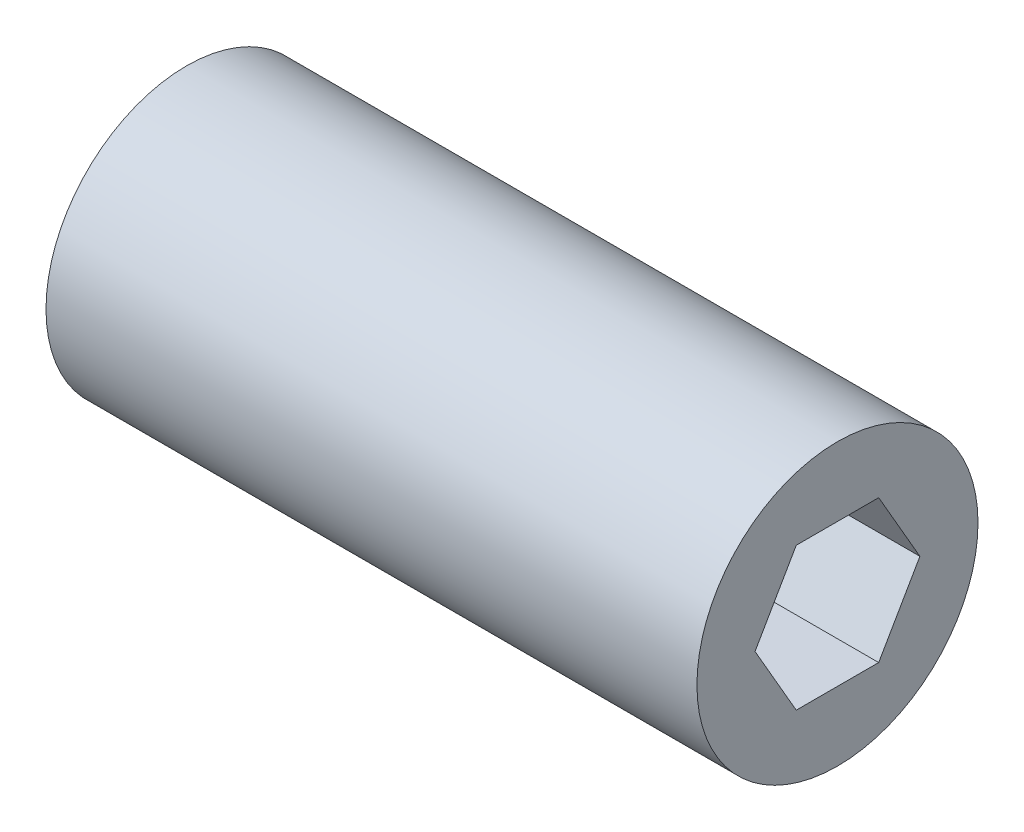
ISO-10303-21;
HEADER;
FILE_DESCRIPTION(('STEP AP214'),'2;1');
FILE_NAME('part.step','',(''),(''),'','','');
FILE_SCHEMA(('AUTOMOTIVE_DESIGN { 1 0 10303 214 1 1 1 1 }'));
ENDSEC;
DATA;
#1=APPLICATION_CONTEXT('core data for automotive mechanical design processes');
#2=APPLICATION_PROTOCOL_DEFINITION('international standard','automotive_design',2000,#1);
#3=PRODUCT_CONTEXT('',#1,'mechanical');
#4=PRODUCT('Part','Part','',(#3));
#5=PRODUCT_RELATED_PRODUCT_CATEGORY('part','',(#4));
#6=PRODUCT_DEFINITION_FORMATION('','',#4);
#7=PRODUCT_DEFINITION_CONTEXT('part definition',#1,'design');
#8=PRODUCT_DEFINITION('design','',#6,#7);
#9=PRODUCT_DEFINITION_SHAPE('','',#8);
#10=(LENGTH_UNIT() NAMED_UNIT(*) SI_UNIT(.MILLI.,.METRE.));
#11=(NAMED_UNIT(*) PLANE_ANGLE_UNIT() SI_UNIT($,.RADIAN.));
#12=(NAMED_UNIT(*) SI_UNIT($,.STERADIAN.) SOLID_ANGLE_UNIT());
#13=UNCERTAINTY_MEASURE_WITH_UNIT(LENGTH_MEASURE(1.E-05),#10,'distance_accuracy_value','');
#14=(GEOMETRIC_REPRESENTATION_CONTEXT(3) GLOBAL_UNCERTAINTY_ASSIGNED_CONTEXT((#13)) GLOBAL_UNIT_ASSIGNED_CONTEXT((#10,
#11,#12)) REPRESENTATION_CONTEXT('',''));
#15=CARTESIAN_POINT('',(0.,0.,0.));
#16=DIRECTION('',(0.,0.,1.));
#17=DIRECTION('',(1.,0.,0.));
#18=AXIS2_PLACEMENT_3D('',#15,#16,#17);
#19=CARTESIAN_POINT('',(57.9,0.,0.));
#20=DIRECTION('',(1.,0.,0.));
#21=DIRECTION('',(0.,0.,-1.));
#22=AXIS2_PLACEMENT_3D('',#19,#20,#21);
#23=PLANE('',#22);
#24=CARTESIAN_POINT('',(57.9,0.,0.));
#25=DIRECTION('',(1.,0.,0.));
#26=DIRECTION('',(0.,0.,-1.));
#27=AXIS2_PLACEMENT_3D('',#24,#25,#26);
#28=CIRCLE('',#27,12.5);
#29=CARTESIAN_POINT('',(57.9,0.,12.5));
#30=VERTEX_POINT('',#29);
#31=EDGE_CURVE('E11',#30,#30,#28,.T.);
#32=ORIENTED_EDGE('',*,*,#31,.T.);
#33=EDGE_LOOP('',(#32));
#34=FACE_BOUND('',#33,.T.);
#35=DIRECTION('',(0.,0.866025403784438,0.500000000000001));
#36=VECTOR('',#35,1.);
#37=CARTESIAN_POINT('',(57.9,0.,-7.33234841870824));
#38=LINE('',#37,#36);
#39=CARTESIAN_POINT('',(57.9,0.,-7.33234841870824));
#40=VERTEX_POINT('',#39);
#41=CARTESIAN_POINT('',(57.9,6.35,-3.6661742093541));
#42=VERTEX_POINT('',#41);
#43=EDGE_CURVE('E102',#40,#42,#38,.T.);
#44=ORIENTED_EDGE('',*,*,#43,.F.);
#45=DIRECTION('',(0.,0.866025403784442,-0.499999999999995));
#46=VECTOR('',#45,1.);
#47=CARTESIAN_POINT('',(57.9,-6.34999999999995,-3.66617420935419));
#48=LINE('',#47,#46);
#49=CARTESIAN_POINT('',(57.9,-6.34999999999995,-3.66617420935419));
#50=VERTEX_POINT('',#49);
#51=EDGE_CURVE('E93',#50,#40,#48,.T.);
#52=ORIENTED_EDGE('',*,*,#51,.F.);
#53=DIRECTION('',(0.,0.,-1.));
#54=VECTOR('',#53,1.);
#55=CARTESIAN_POINT('',(57.9,-6.35000000000003,3.66617420935406));
#56=LINE('',#55,#54);
#57=CARTESIAN_POINT('',(57.9,-6.35000000000003,3.66617420935406));
#58=VERTEX_POINT('',#57);
#59=EDGE_CURVE('E127',#58,#50,#56,.T.);
#60=ORIENTED_EDGE('',*,*,#59,.F.);
#61=DIRECTION('',(0.,-0.866025403784435,-0.500000000000007));
#62=VECTOR('',#61,1.);
#63=CARTESIAN_POINT('',(57.9,0.,7.33234841870824));
#64=LINE('',#63,#62);
#65=CARTESIAN_POINT('',(57.9,0.,7.33234841870824));
#66=VERTEX_POINT('',#65);
#67=EDGE_CURVE('E124',#66,#58,#64,.T.);
#68=ORIENTED_EDGE('',*,*,#67,.F.);
#69=DIRECTION('',(0.,-0.866025403784442,0.499999999999995));
#70=VECTOR('',#69,1.);
#71=CARTESIAN_POINT('',(57.9,6.34999999999998,3.66617420935415));
#72=LINE('',#71,#70);
#73=CARTESIAN_POINT('',(57.9,6.34999999999998,3.66617420935415));
#74=VERTEX_POINT('',#73);
#75=EDGE_CURVE('E119',#74,#66,#72,.T.);
#76=ORIENTED_EDGE('',*,*,#75,.F.);
#77=DIRECTION('',(0.,0.,1.));
#78=VECTOR('',#77,1.);
#79=CARTESIAN_POINT('',(57.9,6.35,-3.6661742093541));
#80=LINE('',#79,#78);
#81=EDGE_CURVE('E115',#42,#74,#80,.T.);
#82=ORIENTED_EDGE('',*,*,#81,.F.);
#83=EDGE_LOOP('',(#44,#52,#60,#68,#76,#82));
#84=FACE_BOUND('',#83,.T.);
#85=ADVANCED_FACE('F39',(#34,#84),#23,.T.);
#86=CARTESIAN_POINT('',(0.,0.,0.));
#87=DIRECTION('',(1.,0.,0.));
#88=DIRECTION('',(0.,0.,-1.));
#89=AXIS2_PLACEMENT_3D('',#86,#87,#88);
#90=PLANE('',#89);
#91=CARTESIAN_POINT('',(0.,0.,0.));
#92=DIRECTION('',(1.,0.,0.));
#93=DIRECTION('',(0.,0.,-1.));
#94=AXIS2_PLACEMENT_3D('',#91,#92,#93);
#95=CIRCLE('',#94,12.5);
#96=CARTESIAN_POINT('',(0.,0.,12.5));
#97=VERTEX_POINT('',#96);
#98=EDGE_CURVE('E43',#97,#97,#95,.T.);
#99=ORIENTED_EDGE('',*,*,#98,.F.);
#100=EDGE_LOOP('',(#99));
#101=FACE_BOUND('',#100,.T.);
#102=DIRECTION('',(0.,0.866025403784442,-0.499999999999995));
#103=VECTOR('',#102,1.);
#104=CARTESIAN_POINT('',(0.,-6.34999999999995,-3.66617420935419));
#105=LINE('',#104,#103);
#106=CARTESIAN_POINT('',(0.,-6.34999999999995,-3.66617420935419));
#107=VERTEX_POINT('',#106);
#108=CARTESIAN_POINT('',(0.,0.,-7.33234841870824));
#109=VERTEX_POINT('',#108);
#110=EDGE_CURVE('E63',#107,#109,#105,.T.);
#111=ORIENTED_EDGE('',*,*,#110,.T.);
#112=DIRECTION('',(0.,0.866025403784438,0.500000000000001));
#113=VECTOR('',#112,1.);
#114=CARTESIAN_POINT('',(0.,0.,-7.33234841870824));
#115=LINE('',#114,#113);
#116=CARTESIAN_POINT('',(0.,6.35,-3.6661742093541));
#117=VERTEX_POINT('',#116);
#118=EDGE_CURVE('E109',#109,#117,#115,.T.);
#119=ORIENTED_EDGE('',*,*,#118,.T.);
#120=DIRECTION('',(0.,0.,1.));
#121=VECTOR('',#120,1.);
#122=CARTESIAN_POINT('',(0.,6.35,-3.6661742093541));
#123=LINE('',#122,#121);
#124=CARTESIAN_POINT('',(0.,6.34999999999998,3.66617420935415));
#125=VERTEX_POINT('',#124);
#126=EDGE_CURVE('E134',#117,#125,#123,.T.);
#127=ORIENTED_EDGE('',*,*,#126,.T.);
#128=DIRECTION('',(0.,-0.866025403784442,0.499999999999995));
#129=VECTOR('',#128,1.);
#130=CARTESIAN_POINT('',(0.,6.34999999999998,3.66617420935415));
#131=LINE('',#130,#129);
#132=CARTESIAN_POINT('',(0.,0.,7.33234841870824));
#133=VERTEX_POINT('',#132);
#134=EDGE_CURVE('E138',#125,#133,#131,.T.);
#135=ORIENTED_EDGE('',*,*,#134,.T.);
#136=DIRECTION('',(0.,-0.866025403784435,-0.500000000000007));
#137=VECTOR('',#136,1.);
#138=CARTESIAN_POINT('',(0.,0.,7.33234841870824));
#139=LINE('',#138,#137);
#140=CARTESIAN_POINT('',(0.,-6.35000000000003,3.66617420935406));
#141=VERTEX_POINT('',#140);
#142=EDGE_CURVE('E142',#133,#141,#139,.T.);
#143=ORIENTED_EDGE('',*,*,#142,.T.);
#144=DIRECTION('',(0.,0.,-1.));
#145=VECTOR('',#144,1.);
#146=CARTESIAN_POINT('',(0.,-6.35000000000003,3.66617420935406));
#147=LINE('',#146,#145);
#148=EDGE_CURVE('E103',#141,#107,#147,.T.);
#149=ORIENTED_EDGE('',*,*,#148,.T.);
#150=EDGE_LOOP('',(#111,#119,#127,#135,#143,#149));
#151=FACE_BOUND('',#150,.T.);
#152=ADVANCED_FACE('F166',(#101,#151),#90,.F.);
#153=CARTESIAN_POINT('',(57.9,0.,0.));
#154=DIRECTION('',(-1.,0.,0.));
#155=DIRECTION('',(0.,0.,1.));
#156=AXIS2_PLACEMENT_3D('',#153,#154,#155);
#157=CYLINDRICAL_SURFACE('',#156,12.5);
#158=CARTESIAN_POINT('',(57.9,0.,12.5));
#159=CARTESIAN_POINT('',(57.296875,0.,12.5));
#160=CARTESIAN_POINT('',(56.69375,0.,12.5));
#161=CARTESIAN_POINT('',(55.4875,0.,12.5));
#162=CARTESIAN_POINT('',(54.884375,0.,12.5));
#163=CARTESIAN_POINT('',(53.678125,0.,12.5));
#164=CARTESIAN_POINT('',(53.075,0.,12.5));
#165=CARTESIAN_POINT('',(51.86875,0.,12.5));
#166=CARTESIAN_POINT('',(51.265625,0.,12.5));
#167=CARTESIAN_POINT('',(50.059375,0.,12.5));
#168=CARTESIAN_POINT('',(49.45625,0.,12.5));
#169=CARTESIAN_POINT('',(48.25,0.,12.5));
#170=CARTESIAN_POINT('',(47.646875,0.,12.5));
#171=CARTESIAN_POINT('',(46.440625,0.,12.5));
#172=CARTESIAN_POINT('',(45.8375,0.,12.5));
#173=CARTESIAN_POINT('',(44.63125,0.,12.5));
#174=CARTESIAN_POINT('',(44.028125,0.,12.5));
#175=CARTESIAN_POINT('',(42.821875,0.,12.5));
#176=CARTESIAN_POINT('',(42.21875,0.,12.5));
#177=CARTESIAN_POINT('',(41.0125,0.,12.5));
#178=CARTESIAN_POINT('',(40.409375,0.,12.5));
#179=CARTESIAN_POINT('',(39.203125,0.,12.5));
#180=CARTESIAN_POINT('',(38.6,0.,12.5));
#181=CARTESIAN_POINT('',(37.39375,0.,12.5));
#182=CARTESIAN_POINT('',(36.790625,0.,12.5));
#183=CARTESIAN_POINT('',(35.584375,0.,12.5));
#184=CARTESIAN_POINT('',(34.98125,0.,12.5));
#185=CARTESIAN_POINT('',(33.775,0.,12.5));
#186=CARTESIAN_POINT('',(33.171875,0.,12.5));
#187=CARTESIAN_POINT('',(31.965625,0.,12.5));
#188=CARTESIAN_POINT('',(31.3625,0.,12.5));
#189=CARTESIAN_POINT('',(30.15625,0.,12.5));
#190=CARTESIAN_POINT('',(29.553125,0.,12.5));
#191=CARTESIAN_POINT('',(28.346875,0.,12.5));
#192=CARTESIAN_POINT('',(27.74375,0.,12.5));
#193=CARTESIAN_POINT('',(26.5375,0.,12.5));
#194=CARTESIAN_POINT('',(25.934375,0.,12.5));
#195=CARTESIAN_POINT('',(24.728125,0.,12.5));
#196=CARTESIAN_POINT('',(24.125,0.,12.5));
#197=CARTESIAN_POINT('',(22.91875,0.,12.5));
#198=CARTESIAN_POINT('',(22.315625,0.,12.5));
#199=CARTESIAN_POINT('',(21.109375,0.,12.5));
#200=CARTESIAN_POINT('',(20.50625,0.,12.5));
#201=CARTESIAN_POINT('',(19.3,0.,12.5));
#202=CARTESIAN_POINT('',(18.696875,0.,12.5));
#203=CARTESIAN_POINT('',(17.490625,0.,12.5));
#204=CARTESIAN_POINT('',(16.8875,0.,12.5));
#205=CARTESIAN_POINT('',(15.68125,0.,12.5));
#206=CARTESIAN_POINT('',(15.078125,0.,12.5));
#207=CARTESIAN_POINT('',(13.871875,0.,12.5));
#208=CARTESIAN_POINT('',(13.26875,0.,12.5));
#209=CARTESIAN_POINT('',(12.0625,0.,12.5));
#210=CARTESIAN_POINT('',(11.459375,0.,12.5));
#211=CARTESIAN_POINT('',(10.253125,0.,12.5));
#212=CARTESIAN_POINT('',(9.65,0.,12.5));
#213=CARTESIAN_POINT('',(8.44375,0.,12.5));
#214=CARTESIAN_POINT('',(7.840625,0.,12.5));
#215=CARTESIAN_POINT('',(6.634375,0.,12.5));
#216=CARTESIAN_POINT('',(6.03125,0.,12.5));
#217=CARTESIAN_POINT('',(4.825,0.,12.5));
#218=CARTESIAN_POINT('',(4.221875,0.,12.5));
#219=CARTESIAN_POINT('',(3.015625,0.,12.5));
#220=CARTESIAN_POINT('',(2.4125,0.,12.5));
#221=CARTESIAN_POINT('',(1.20625,0.,12.5));
#222=CARTESIAN_POINT('',(0.603125,0.,12.5));
#223=CARTESIAN_POINT('',(0.,0.,12.5));
#224=B_SPLINE_CURVE_WITH_KNOTS('',3,(#158,#159,#160,#161,#162,#163,#164,#165,#166,#167,#168,
#169,#170,#171,#172,#173,#174,#175,#176,#177,#178,#179,#180,#181,#182,#183,#184,#185,#186,#187,
#188,#189,#190,#191,#192,#193,#194,#195,#196,#197,#198,#199,#200,#201,#202,#203,#204,#205,#206,
#207,#208,#209,#210,#211,#212,#213,#214,#215,#216,#217,#218,#219,#220,#221,#222,#223),
.UNSPECIFIED.,.F.,.F.,(4,2,2,2,2,2,2,2,2,2,2,2,2,2,2,2,2,2,2,2,2,2,2,2,2,2,2,2,2,2,2,2,4),(0.,
1.809375,3.61875,5.42812500000001,7.2375,9.046875,10.85625,12.665625,14.475,16.284375,18.09375,
19.903125,21.7125,23.521875,25.33125,27.140625,28.95,30.759375,32.56875,34.378125,36.1875,
37.996875,39.80625,41.615625,43.425,45.234375,47.04375,48.853125,50.6625,52.471875,54.28125,
56.090625,57.9),.UNSPECIFIED.);
#225=EDGE_CURVE('BSEAM41',#30,#97,#224,.T.);
#226=ORIENTED_EDGE('',*,*,#31,.F.);
#227=ORIENTED_EDGE('',*,*,#98,.T.);
#228=ORIENTED_EDGE('',*,*,#225,.T.);
#229=ORIENTED_EDGE('',*,*,#225,.F.);
#230=EDGE_LOOP('',(#226,#228,#227,#229));
#231=FACE_BOUND('',#230,.T.);
#232=ADVANCED_FACE('F41',(#231),#157,.T.);
#233=CARTESIAN_POINT('',(57.9,-6.34999999999995,-3.66617420935419));
#234=DIRECTION('',(0.,0.499999999999995,0.866025403784442));
#235=DIRECTION('',(0.,-0.866025403784442,0.499999999999995));
#236=AXIS2_PLACEMENT_3D('',#233,#234,#235);
#237=PLANE('',#236);
#238=ORIENTED_EDGE('',*,*,#110,.F.);
#239=DIRECTION('',(-1.,0.,0.));
#240=VECTOR('',#239,1.);
#241=CARTESIAN_POINT('',(57.9,-6.34999999999995,-3.66617420935419));
#242=LINE('',#241,#240);
#243=EDGE_CURVE('E97',#50,#107,#242,.T.);
#244=ORIENTED_EDGE('',*,*,#243,.F.);
#245=ORIENTED_EDGE('',*,*,#51,.T.);
#246=DIRECTION('',(-1.,0.,0.));
#247=VECTOR('',#246,1.);
#248=CARTESIAN_POINT('',(57.9,0.,-7.33234841870824));
#249=LINE('',#248,#247);
#250=EDGE_CURVE('E96',#40,#109,#249,.T.);
#251=ORIENTED_EDGE('',*,*,#250,.T.);
#252=EDGE_LOOP('',(#238,#244,#245,#251));
#253=FACE_BOUND('',#252,.T.);
#254=ADVANCED_FACE('F95',(#253),#237,.T.);
#255=CARTESIAN_POINT('',(57.9,0.,-7.33234841870824));
#256=DIRECTION('',(0.,-0.500000000000001,0.866025403784438));
#257=DIRECTION('',(0.,-0.866025403784438,-0.500000000000001));
#258=AXIS2_PLACEMENT_3D('',#255,#256,#257);
#259=PLANE('',#258);
#260=ORIENTED_EDGE('',*,*,#118,.F.);
#261=ORIENTED_EDGE('',*,*,#250,.F.);
#262=ORIENTED_EDGE('',*,*,#43,.T.);
#263=DIRECTION('',(-1.,0.,0.));
#264=VECTOR('',#263,1.);
#265=CARTESIAN_POINT('',(57.9,6.35,-3.6661742093541));
#266=LINE('',#265,#264);
#267=EDGE_CURVE('E111',#42,#117,#266,.T.);
#268=ORIENTED_EDGE('',*,*,#267,.T.);
#269=EDGE_LOOP('',(#260,#261,#262,#268));
#270=FACE_BOUND('',#269,.T.);
#271=ADVANCED_FACE('F106',(#270),#259,.T.);
#272=CARTESIAN_POINT('',(57.9,6.35,-3.6661742093541));
#273=DIRECTION('',(0.,-1.,0.));
#274=DIRECTION('',(0.,0.,-1.));
#275=AXIS2_PLACEMENT_3D('',#272,#273,#274);
#276=PLANE('',#275);
#277=ORIENTED_EDGE('',*,*,#126,.F.);
#278=ORIENTED_EDGE('',*,*,#267,.F.);
#279=ORIENTED_EDGE('',*,*,#81,.T.);
#280=DIRECTION('',(-1.,0.,0.));
#281=VECTOR('',#280,1.);
#282=CARTESIAN_POINT('',(57.9,6.34999999999998,3.66617420935415));
#283=LINE('',#282,#281);
#284=EDGE_CURVE('E156',#74,#125,#283,.T.);
#285=ORIENTED_EDGE('',*,*,#284,.T.);
#286=EDGE_LOOP('',(#277,#278,#279,#285));
#287=FACE_BOUND('',#286,.T.);
#288=ADVANCED_FACE('F162',(#287),#276,.T.);
#289=CARTESIAN_POINT('',(57.9,6.34999999999998,3.66617420935415));
#290=DIRECTION('',(0.,-0.499999999999995,-0.866025403784442));
#291=DIRECTION('',(0.,0.866025403784442,-0.499999999999995));
#292=AXIS2_PLACEMENT_3D('',#289,#290,#291);
#293=PLANE('',#292);
#294=ORIENTED_EDGE('',*,*,#134,.F.);
#295=ORIENTED_EDGE('',*,*,#284,.F.);
#296=ORIENTED_EDGE('',*,*,#75,.T.);
#297=DIRECTION('',(-1.,0.,0.));
#298=VECTOR('',#297,1.);
#299=CARTESIAN_POINT('',(57.9,0.,7.33234841870824));
#300=LINE('',#299,#298);
#301=EDGE_CURVE('E153',#66,#133,#300,.T.);
#302=ORIENTED_EDGE('',*,*,#301,.T.);
#303=EDGE_LOOP('',(#294,#295,#296,#302));
#304=FACE_BOUND('',#303,.T.);
#305=ADVANCED_FACE('F174',(#304),#293,.T.);
#306=CARTESIAN_POINT('',(57.9,0.,7.33234841870824));
#307=DIRECTION('',(0.,0.500000000000007,-0.866025403784434));
#308=DIRECTION('',(0.,0.866025403784435,0.500000000000007));
#309=AXIS2_PLACEMENT_3D('',#306,#307,#308);
#310=PLANE('',#309);
#311=ORIENTED_EDGE('',*,*,#142,.F.);
#312=ORIENTED_EDGE('',*,*,#301,.F.);
#313=ORIENTED_EDGE('',*,*,#67,.T.);
#314=DIRECTION('',(-1.,0.,0.));
#315=VECTOR('',#314,1.);
#316=CARTESIAN_POINT('',(57.9,-6.35000000000003,3.66617420935406));
#317=LINE('',#316,#315);
#318=EDGE_CURVE('E55',#58,#141,#317,.T.);
#319=ORIENTED_EDGE('',*,*,#318,.T.);
#320=EDGE_LOOP('',(#311,#312,#313,#319));
#321=FACE_BOUND('',#320,.T.);
#322=ADVANCED_FACE('F172',(#321),#310,.T.);
#323=CARTESIAN_POINT('',(57.9,-6.35000000000003,3.66617420935406));
#324=DIRECTION('',(0.,1.,0.));
#325=DIRECTION('',(0.,0.,1.));
#326=AXIS2_PLACEMENT_3D('',#323,#324,#325);
#327=PLANE('',#326);
#328=ORIENTED_EDGE('',*,*,#148,.F.);
#329=ORIENTED_EDGE('',*,*,#318,.F.);
#330=ORIENTED_EDGE('',*,*,#59,.T.);
#331=ORIENTED_EDGE('',*,*,#243,.T.);
#332=EDGE_LOOP('',(#328,#329,#330,#331));
#333=FACE_BOUND('',#332,.T.);
#334=ADVANCED_FACE('F168',(#333),#327,.T.);
#335=CLOSED_SHELL('',(#85,#152,#232,#254,#271,#288,#305,#322,#334));
#336=MANIFOLD_SOLID_BREP('B2',#335);
#337=ADVANCED_BREP_SHAPE_REPRESENTATION('',(#18,#336),#14);
#338=SHAPE_DEFINITION_REPRESENTATION(#9,#337);
ENDSEC;
END-ISO-10303-21;
